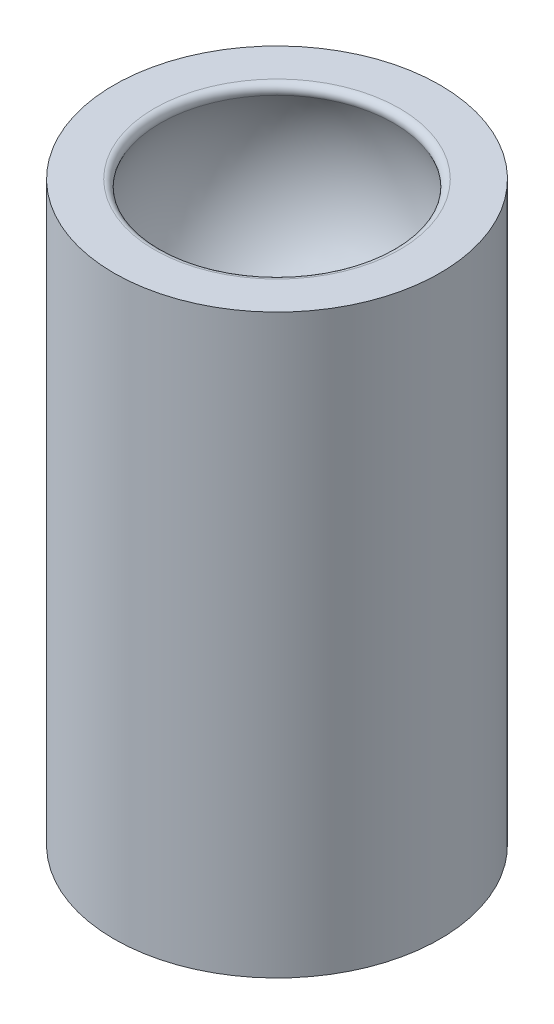
ISO-10303-21;
HEADER;
FILE_DESCRIPTION(('STEP AP214'),'2;1');
FILE_NAME('part.step','',(''),(''),'','','');
FILE_SCHEMA(('AUTOMOTIVE_DESIGN { 1 0 10303 214 1 1 1 1 }'));
ENDSEC;
DATA;
#1=APPLICATION_CONTEXT('core data for automotive mechanical design processes');
#2=APPLICATION_PROTOCOL_DEFINITION('international standard','automotive_design',2000,#1);
#3=PRODUCT_CONTEXT('',#1,'mechanical');
#4=PRODUCT('Part','Part','',(#3));
#5=PRODUCT_RELATED_PRODUCT_CATEGORY('part','',(#4));
#6=PRODUCT_DEFINITION_FORMATION('','',#4);
#7=PRODUCT_DEFINITION_CONTEXT('part definition',#1,'design');
#8=PRODUCT_DEFINITION('design','',#6,#7);
#9=PRODUCT_DEFINITION_SHAPE('','',#8);
#10=(LENGTH_UNIT() NAMED_UNIT(*) SI_UNIT(.MILLI.,.METRE.));
#11=(NAMED_UNIT(*) PLANE_ANGLE_UNIT() SI_UNIT($,.RADIAN.));
#12=(NAMED_UNIT(*) SI_UNIT($,.STERADIAN.) SOLID_ANGLE_UNIT());
#13=UNCERTAINTY_MEASURE_WITH_UNIT(LENGTH_MEASURE(1.E-05),#10,'distance_accuracy_value','');
#14=(GEOMETRIC_REPRESENTATION_CONTEXT(3) GLOBAL_UNCERTAINTY_ASSIGNED_CONTEXT((#13)) GLOBAL_UNIT_ASSIGNED_CONTEXT((#10,
#11,#12)) REPRESENTATION_CONTEXT('',''));
#15=CARTESIAN_POINT('',(0.,0.,0.));
#16=DIRECTION('',(0.,0.,1.));
#17=DIRECTION('',(1.,0.,0.));
#18=AXIS2_PLACEMENT_3D('',#15,#16,#17);
#19=CARTESIAN_POINT('',(0.,17.25,0.));
#20=DIRECTION('',(0.,-1.,0.));
#21=DIRECTION('',(0.,0.,-1.));
#22=AXIS2_PLACEMENT_3D('',#19,#20,#21);
#23=CYLINDRICAL_SURFACE('',#22,2.375);
#24=CARTESIAN_POINT('',(0.,0.,0.));
#25=DIRECTION('',(0.,1.,0.));
#26=DIRECTION('',(0.,0.,1.));
#27=AXIS2_PLACEMENT_3D('',#24,#25,#26);
#28=CIRCLE('',#27,2.375);
#29=CARTESIAN_POINT('',(0.,0.,2.375));
#30=VERTEX_POINT('',#29);
#31=EDGE_CURVE('E67',#30,#30,#28,.T.);
#32=ORIENTED_EDGE('',*,*,#31,.F.);
#33=EDGE_LOOP('',(#32));
#34=FACE_BOUND('',#33,.T.);
#35=CARTESIAN_POINT('',(0.,11.7814017026041,0.));
#36=DIRECTION('',(0.,1.,0.));
#37=DIRECTION('',(0.,0.,1.));
#38=AXIS2_PLACEMENT_3D('',#35,#36,#37);
#39=CIRCLE('',#38,2.375);
#40=CARTESIAN_POINT('',(0.,11.7814017026041,2.375));
#41=VERTEX_POINT('',#40);
#42=EDGE_CURVE('E70',#41,#41,#39,.T.);
#43=ORIENTED_EDGE('',*,*,#42,.T.);
#44=EDGE_LOOP('',(#43));
#45=FACE_BOUND('',#44,.T.);
#46=ADVANCED_FACE('F43',(#34,#45),#23,.F.);
#47=CARTESIAN_POINT('',(0.,17.25,0.));
#48=DIRECTION('',(0.,-1.,0.));
#49=DIRECTION('',(0.,0.,-1.));
#50=AXIS2_PLACEMENT_3D('',#47,#48,#49);
#51=CYLINDRICAL_SURFACE('',#50,4.875);
#52=CARTESIAN_POINT('',(0.,17.25,0.));
#53=DIRECTION('',(0.,1.,0.));
#54=DIRECTION('',(0.,0.,1.));
#55=AXIS2_PLACEMENT_3D('',#52,#53,#54);
#56=CIRCLE('',#55,4.875);
#57=CARTESIAN_POINT('',(0.,17.25,4.875));
#58=VERTEX_POINT('',#57);
#59=EDGE_CURVE('E56',#58,#58,#56,.T.);
#60=ORIENTED_EDGE('',*,*,#59,.F.);
#61=EDGE_LOOP('',(#60));
#62=FACE_BOUND('',#61,.T.);
#63=CARTESIAN_POINT('',(0.,0.,0.));
#64=DIRECTION('',(0.,1.,0.));
#65=DIRECTION('',(0.,0.,1.));
#66=AXIS2_PLACEMENT_3D('',#63,#64,#65);
#67=CIRCLE('',#66,4.875);
#68=CARTESIAN_POINT('',(0.,0.,4.875));
#69=VERTEX_POINT('',#68);
#70=EDGE_CURVE('E61',#69,#69,#67,.T.);
#71=ORIENTED_EDGE('',*,*,#70,.T.);
#72=EDGE_LOOP('',(#71));
#73=FACE_BOUND('',#72,.T.);
#74=ADVANCED_FACE('F91',(#62,#73),#51,.T.);
#75=CARTESIAN_POINT('',(0.,17.25,0.));
#76=DIRECTION('',(0.,1.,0.));
#77=DIRECTION('',(0.,0.,1.));
#78=AXIS2_PLACEMENT_3D('',#75,#76,#77);
#79=PLANE('',#78);
#80=CARTESIAN_POINT('',(0.,17.25,0.));
#81=DIRECTION('',(0.,1.,0.));
#82=DIRECTION('',(0.,0.,1.));
#83=AXIS2_PLACEMENT_3D('',#80,#81,#82);
#84=CIRCLE('',#83,3.66571957465379);
#85=CARTESIAN_POINT('',(0.,17.25,3.66571957465379));
#86=VERTEX_POINT('',#85);
#87=EDGE_CURVE('E51',#86,#86,#84,.F.);
#88=ORIENTED_EDGE('',*,*,#87,.T.);
#89=EDGE_LOOP('',(#88));
#90=FACE_BOUND('',#89,.T.);
#91=ORIENTED_EDGE('',*,*,#59,.T.);
#92=EDGE_LOOP('',(#91));
#93=FACE_BOUND('',#92,.T.);
#94=ADVANCED_FACE('F86',(#90,#93),#79,.T.);
#95=CARTESIAN_POINT('',(0.,0.,0.));
#96=DIRECTION('',(0.,1.,0.));
#97=DIRECTION('',(0.,0.,1.));
#98=AXIS2_PLACEMENT_3D('',#95,#96,#97);
#99=PLANE('',#98);
#100=ORIENTED_EDGE('',*,*,#31,.T.);
#101=EDGE_LOOP('',(#100));
#102=FACE_BOUND('',#101,.T.);
#103=ORIENTED_EDGE('',*,*,#70,.F.);
#104=EDGE_LOOP('',(#103));
#105=FACE_BOUND('',#104,.T.);
#106=ADVANCED_FACE('F79',(#102,#105),#99,.F.);
#107=CARTESIAN_POINT('',(0.,15.,0.));
#108=DIRECTION('',(0.,0.,-1.));
#109=DIRECTION('',(-1.,0.,0.));
#110=AXIS2_PLACEMENT_3D('',#107,#108,#109);
#111=SPHERICAL_SURFACE('',#110,4.);
#112=CARTESIAN_POINT('',(0.,15.,0.));
#113=DIRECTION('',(0.,-1.,0.));
#114=DIRECTION('',(0.,0.,-1.));
#115=AXIS2_PLACEMENT_3D('',#112,#113,#114);
#116=SPHERICAL_SURFACE('',#115,4.);
#117=CARTESIAN_POINT('',(0.,16.952380952381,0.));
#118=DIRECTION('',(0.,-1.,0.));
#119=DIRECTION('',(0.,0.,-1.));
#120=AXIS2_PLACEMENT_3D('',#117,#118,#119);
#121=CIRCLE('',#120,3.49116149967028);
#122=CARTESIAN_POINT('',(0.,16.952380952381,-3.49116149967028));
#123=VERTEX_POINT('',#122);
#124=EDGE_CURVE('E10',#123,#123,#121,.F.);
#125=ORIENTED_EDGE('',*,*,#124,.T.);
#126=EDGE_LOOP('',(#125));
#127=FACE_BOUND('',#126,.T.);
#128=ORIENTED_EDGE('',*,*,#42,.F.);
#129=EDGE_LOOP('',(#128));
#130=FACE_BOUND('',#129,.T.);
#131=ADVANCED_FACE('F77',(#127,#130),#116,.F.);
#132=CARTESIAN_POINT('',(0.,17.05,0.));
#133=DIRECTION('',(0.,1.,0.));
#134=DIRECTION('',(0.,0.,1.));
#135=AXIS2_PLACEMENT_3D('',#132,#133,#134);
#136=TOROIDAL_SURFACE('',#135,3.66571957465379,0.2);
#137=ORIENTED_EDGE('',*,*,#124,.F.);
#138=EDGE_LOOP('',(#137));
#139=FACE_BOUND('',#138,.T.);
#140=ORIENTED_EDGE('',*,*,#87,.F.);
#141=EDGE_LOOP('',(#140));
#142=FACE_BOUND('',#141,.T.);
#143=ADVANCED_FACE('F45',(#139,#142),#136,.T.);
#144=CLOSED_SHELL('',(#46,#74,#94,#106,#131,#143));
#145=MANIFOLD_SOLID_BREP('B2',#144);
#146=ADVANCED_BREP_SHAPE_REPRESENTATION('',(#18,#145),#14);
#147=SHAPE_DEFINITION_REPRESENTATION(#9,#146);
ENDSEC;
END-ISO-10303-21;
